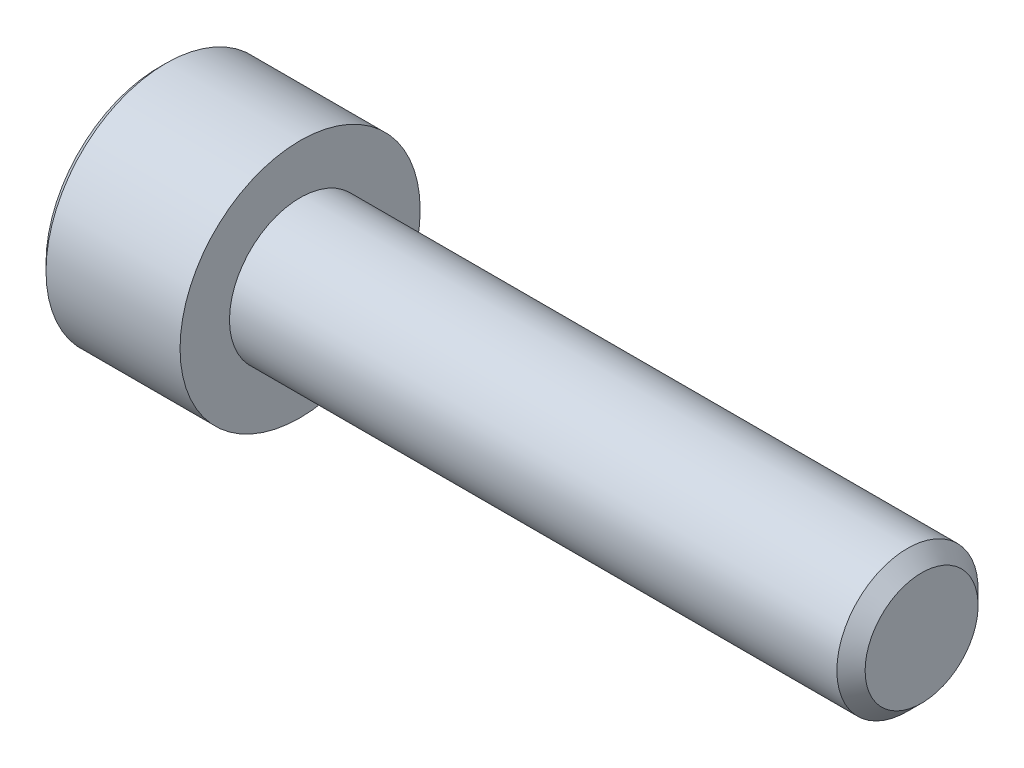
ISO-10303-21;
HEADER;
FILE_DESCRIPTION(('STEP AP214'),'2;1');
FILE_NAME('part.step','',(''),(''),'','','');
FILE_SCHEMA(('AUTOMOTIVE_DESIGN { 1 0 10303 214 1 1 1 1 }'));
ENDSEC;
DATA;
#1=APPLICATION_CONTEXT('core data for automotive mechanical design processes');
#2=APPLICATION_PROTOCOL_DEFINITION('international standard','automotive_design',2000,#1);
#3=PRODUCT_CONTEXT('',#1,'mechanical');
#4=PRODUCT('Part','Part','',(#3));
#5=PRODUCT_RELATED_PRODUCT_CATEGORY('part','',(#4));
#6=PRODUCT_DEFINITION_FORMATION('','',#4);
#7=PRODUCT_DEFINITION_CONTEXT('part definition',#1,'design');
#8=PRODUCT_DEFINITION('design','',#6,#7);
#9=PRODUCT_DEFINITION_SHAPE('','',#8);
#10=(LENGTH_UNIT() NAMED_UNIT(*) SI_UNIT(.MILLI.,.METRE.));
#11=(NAMED_UNIT(*) PLANE_ANGLE_UNIT() SI_UNIT($,.RADIAN.));
#12=(NAMED_UNIT(*) SI_UNIT($,.STERADIAN.) SOLID_ANGLE_UNIT());
#13=UNCERTAINTY_MEASURE_WITH_UNIT(LENGTH_MEASURE(1.E-05),#10,'distance_accuracy_value','');
#14=(GEOMETRIC_REPRESENTATION_CONTEXT(3) GLOBAL_UNCERTAINTY_ASSIGNED_CONTEXT((#13)) GLOBAL_UNIT_ASSIGNED_CONTEXT((#10,
#11,#12)) REPRESENTATION_CONTEXT('',''));
#15=CARTESIAN_POINT('',(0.,0.,0.));
#16=DIRECTION('',(0.,0.,1.));
#17=DIRECTION('',(1.,0.,0.));
#18=AXIS2_PLACEMENT_3D('',#15,#16,#17);
#19=CARTESIAN_POINT('',(0.,0.,0.));
#20=DIRECTION('',(-1.,0.,0.));
#21=DIRECTION('',(0.,0.,1.));
#22=AXIS2_PLACEMENT_3D('',#19,#20,#21);
#23=PLANE('',#22);
#24=CARTESIAN_POINT('',(0.,0.,0.));
#25=DIRECTION('',(-1.,0.,0.));
#26=DIRECTION('',(0.,0.,1.));
#27=AXIS2_PLACEMENT_3D('',#24,#25,#26);
#28=CIRCLE('',#27,1.99999999999999);
#29=CARTESIAN_POINT('',(0.,0.,1.99999999999999));
#30=VERTEX_POINT('',#29);
#31=EDGE_CURVE('E149',#30,#30,#28,.F.);
#32=ORIENTED_EDGE('',*,*,#31,.T.);
#33=EDGE_LOOP('',(#32));
#34=FACE_BOUND('',#33,.T.);
#35=ADVANCED_FACE('F44',(#34),#23,.F.);
#36=CARTESIAN_POINT('',(0.,0.,0.));
#37=DIRECTION('',(-1.,0.,0.));
#38=DIRECTION('',(0.,0.,1.));
#39=AXIS2_PLACEMENT_3D('',#36,#37,#38);
#40=CYLINDRICAL_SURFACE('',#39,2.5);
#41=CARTESIAN_POINT('',(-0.500000000000002,0.,0.));
#42=DIRECTION('',(-1.,0.,0.));
#43=DIRECTION('',(0.,0.,1.));
#44=AXIS2_PLACEMENT_3D('',#41,#42,#43);
#45=CIRCLE('',#44,2.5);
#46=CARTESIAN_POINT('',(-0.500000000000002,0.,2.5));
#47=VERTEX_POINT('',#46);
#48=EDGE_CURVE('E145',#47,#47,#45,.T.);
#49=ORIENTED_EDGE('',*,*,#48,.T.);
#50=EDGE_LOOP('',(#49));
#51=FACE_BOUND('',#50,.T.);
#52=CARTESIAN_POINT('',(-22.,0.,0.));
#53=DIRECTION('',(-1.,0.,0.));
#54=DIRECTION('',(0.,0.,1.));
#55=AXIS2_PLACEMENT_3D('',#52,#53,#54);
#56=CIRCLE('',#55,2.5);
#57=CARTESIAN_POINT('',(-22.,0.,2.5));
#58=VERTEX_POINT('',#57);
#59=EDGE_CURVE('E141',#58,#58,#56,.T.);
#60=ORIENTED_EDGE('',*,*,#59,.F.);
#61=EDGE_LOOP('',(#60));
#62=FACE_BOUND('',#61,.T.);
#63=ADVANCED_FACE('F173',(#51,#62),#40,.T.);
#64=CARTESIAN_POINT('',(-22.,2.5,0.));
#65=DIRECTION('',(-1.,0.,0.));
#66=DIRECTION('',(0.,0.,1.));
#67=AXIS2_PLACEMENT_3D('',#64,#65,#66);
#68=PLANE('',#67);
#69=CARTESIAN_POINT('',(-22.,0.,0.));
#70=DIRECTION('',(-1.,0.,0.));
#71=DIRECTION('',(0.,0.,1.));
#72=AXIS2_PLACEMENT_3D('',#69,#70,#71);
#73=CIRCLE('',#72,4.25);
#74=CARTESIAN_POINT('',(-22.,0.,4.25));
#75=VERTEX_POINT('',#74);
#76=EDGE_CURVE('E126',#75,#75,#73,.T.);
#77=ORIENTED_EDGE('',*,*,#76,.F.);
#78=EDGE_LOOP('',(#77));
#79=FACE_BOUND('',#78,.T.);
#80=ORIENTED_EDGE('',*,*,#59,.T.);
#81=EDGE_LOOP('',(#80));
#82=FACE_BOUND('',#81,.T.);
#83=ADVANCED_FACE('F178',(#79,#82),#68,.F.);
#84=CARTESIAN_POINT('',(0.,0.,0.));
#85=DIRECTION('',(-1.,0.,0.));
#86=DIRECTION('',(0.,0.,1.));
#87=AXIS2_PLACEMENT_3D('',#84,#85,#86);
#88=CYLINDRICAL_SURFACE('',#87,4.25);
#89=CARTESIAN_POINT('',(-26.745,0.,0.));
#90=DIRECTION('',(1.,0.,0.));
#91=DIRECTION('',(0.,0.,-1.));
#92=AXIS2_PLACEMENT_3D('',#89,#90,#91);
#93=CIRCLE('',#92,4.25);
#94=CARTESIAN_POINT('',(-26.745,0.,-4.25));
#95=VERTEX_POINT('',#94);
#96=EDGE_CURVE('E11',#95,#95,#93,.T.);
#97=ORIENTED_EDGE('',*,*,#96,.T.);
#98=EDGE_LOOP('',(#97));
#99=FACE_BOUND('',#98,.T.);
#100=ORIENTED_EDGE('',*,*,#76,.T.);
#101=EDGE_LOOP('',(#100));
#102=FACE_BOUND('',#101,.T.);
#103=ADVANCED_FACE('F190',(#99,#102),#88,.T.);
#104=CARTESIAN_POINT('',(-27.,4.25,0.));
#105=DIRECTION('',(1.,0.,0.));
#106=DIRECTION('',(0.,0.,-1.));
#107=AXIS2_PLACEMENT_3D('',#104,#105,#106);
#108=PLANE('',#107);
#109=CARTESIAN_POINT('',(-27.,0.,0.));
#110=DIRECTION('',(1.,0.,0.));
#111=DIRECTION('',(0.,0.,-1.));
#112=AXIS2_PLACEMENT_3D('',#109,#110,#111);
#113=CIRCLE('',#112,3.995);
#114=CARTESIAN_POINT('',(-27.,0.,-3.995));
#115=VERTEX_POINT('',#114);
#116=EDGE_CURVE('E53',#115,#115,#113,.F.);
#117=ORIENTED_EDGE('',*,*,#116,.T.);
#118=EDGE_LOOP('',(#117));
#119=FACE_BOUND('',#118,.T.);
#120=DIRECTION('',(0.,-0.5,-0.866025403784439));
#121=VECTOR('',#120,1.);
#122=CARTESIAN_POINT('',(-27.,2.3094010767585,0.));
#123=LINE('',#122,#121);
#124=CARTESIAN_POINT('',(-27.,2.3094010767585,0.));
#125=VERTEX_POINT('',#124);
#126=CARTESIAN_POINT('',(-27.,1.15470053837925,-2.));
#127=VERTEX_POINT('',#126);
#128=EDGE_CURVE('E377',#125,#127,#123,.T.);
#129=ORIENTED_EDGE('',*,*,#128,.F.);
#130=DIRECTION('',(0.,0.5,-0.866025403784439));
#131=VECTOR('',#130,1.);
#132=CARTESIAN_POINT('',(-27.,1.15470053837925,2.));
#133=LINE('',#132,#131);
#134=CARTESIAN_POINT('',(-27.,1.15470053837925,2.));
#135=VERTEX_POINT('',#134);
#136=EDGE_CURVE('E60',#135,#125,#133,.T.);
#137=ORIENTED_EDGE('',*,*,#136,.F.);
#138=DIRECTION('',(0.,1.,0.));
#139=VECTOR('',#138,1.);
#140=CARTESIAN_POINT('',(-27.,-1.15470053837925,2.));
#141=LINE('',#140,#139);
#142=CARTESIAN_POINT('',(-27.,-1.15470053837925,2.));
#143=VERTEX_POINT('',#142);
#144=EDGE_CURVE('E95',#143,#135,#141,.T.);
#145=ORIENTED_EDGE('',*,*,#144,.F.);
#146=DIRECTION('',(0.,0.5,0.866025403784439));
#147=VECTOR('',#146,1.);
#148=CARTESIAN_POINT('',(-27.,-2.3094010767585,0.));
#149=LINE('',#148,#147);
#150=CARTESIAN_POINT('',(-27.,-2.3094010767585,0.));
#151=VERTEX_POINT('',#150);
#152=EDGE_CURVE('E104',#151,#143,#149,.T.);
#153=ORIENTED_EDGE('',*,*,#152,.F.);
#154=DIRECTION('',(0.,-0.5,0.866025403784439));
#155=VECTOR('',#154,1.);
#156=CARTESIAN_POINT('',(-27.,-1.15470053837925,-2.));
#157=LINE('',#156,#155);
#158=CARTESIAN_POINT('',(-27.,-1.15470053837925,-2.));
#159=VERTEX_POINT('',#158);
#160=EDGE_CURVE('E111',#159,#151,#157,.T.);
#161=ORIENTED_EDGE('',*,*,#160,.F.);
#162=DIRECTION('',(0.,-1.,0.));
#163=VECTOR('',#162,1.);
#164=CARTESIAN_POINT('',(-27.,1.15470053837925,-2.));
#165=LINE('',#164,#163);
#166=EDGE_CURVE('E381',#127,#159,#165,.T.);
#167=ORIENTED_EDGE('',*,*,#166,.F.);
#168=EDGE_LOOP('',(#129,#137,#145,#153,#161,#167));
#169=FACE_BOUND('',#168,.T.);
#170=ADVANCED_FACE('F114',(#119,#169),#108,.F.);
#171=CARTESIAN_POINT('',(-0.500000000000002,0.,0.));
#172=DIRECTION('',(-1.,0.,0.));
#173=DIRECTION('',(0.,0.,1.));
#174=AXIS2_PLACEMENT_3D('',#171,#172,#173);
#175=CONICAL_SURFACE('',#174,2.5,0.78539816339745);
#176=ORIENTED_EDGE('',*,*,#31,.F.);
#177=EDGE_LOOP('',(#176));
#178=FACE_BOUND('',#177,.T.);
#179=ORIENTED_EDGE('',*,*,#48,.F.);
#180=EDGE_LOOP('',(#179));
#181=FACE_BOUND('',#180,.T.);
#182=ADVANCED_FACE('F182',(#178,#181),#175,.T.);
#183=CARTESIAN_POINT('',(-24.5,1.15470053837925,2.));
#184=DIRECTION('',(0.,0.866025403784439,0.5));
#185=DIRECTION('',(0.,-0.5,0.866025403784439));
#186=AXIS2_PLACEMENT_3D('',#183,#184,#185);
#187=PLANE('',#186);
#188=ORIENTED_EDGE('',*,*,#136,.T.);
#189=DIRECTION('',(-1.,0.,0.));
#190=VECTOR('',#189,1.);
#191=CARTESIAN_POINT('',(-24.5,2.3094010767585,0.));
#192=LINE('',#191,#190);
#193=CARTESIAN_POINT('',(-24.5,2.3094010767585,0.));
#194=VERTEX_POINT('',#193);
#195=EDGE_CURVE('E135',#194,#125,#192,.T.);
#196=ORIENTED_EDGE('',*,*,#195,.F.);
#197=DIRECTION('',(0.,0.5,-0.866025403784439));
#198=VECTOR('',#197,1.);
#199=CARTESIAN_POINT('',(-24.5,1.15470053837925,2.));
#200=LINE('',#199,#198);
#201=CARTESIAN_POINT('',(-24.5,1.15470053837925,2.));
#202=VERTEX_POINT('',#201);
#203=EDGE_CURVE('E116',#202,#194,#200,.T.);
#204=ORIENTED_EDGE('',*,*,#203,.F.);
#205=DIRECTION('',(-1.,0.,0.));
#206=VECTOR('',#205,1.);
#207=CARTESIAN_POINT('',(-24.5,1.15470053837925,2.));
#208=LINE('',#207,#206);
#209=EDGE_CURVE('E100',#202,#135,#208,.T.);
#210=ORIENTED_EDGE('',*,*,#209,.T.);
#211=EDGE_LOOP('',(#188,#196,#204,#210));
#212=FACE_BOUND('',#211,.T.);
#213=ADVANCED_FACE('F184',(#212),#187,.F.);
#214=CARTESIAN_POINT('',(-24.5,-1.15470053837925,2.));
#215=DIRECTION('',(0.,0.,1.));
#216=DIRECTION('',(0.,-1.,0.));
#217=AXIS2_PLACEMENT_3D('',#214,#215,#216);
#218=PLANE('',#217);
#219=ORIENTED_EDGE('',*,*,#144,.T.);
#220=ORIENTED_EDGE('',*,*,#209,.F.);
#221=DIRECTION('',(0.,1.,0.));
#222=VECTOR('',#221,1.);
#223=CARTESIAN_POINT('',(-24.5,-1.15470053837925,2.));
#224=LINE('',#223,#222);
#225=CARTESIAN_POINT('',(-24.5,-1.15470053837925,2.));
#226=VERTEX_POINT('',#225);
#227=EDGE_CURVE('E97',#226,#202,#224,.T.);
#228=ORIENTED_EDGE('',*,*,#227,.F.);
#229=DIRECTION('',(-1.,0.,0.));
#230=VECTOR('',#229,1.);
#231=CARTESIAN_POINT('',(-24.5,-1.15470053837925,2.));
#232=LINE('',#231,#230);
#233=EDGE_CURVE('E90',#226,#143,#232,.T.);
#234=ORIENTED_EDGE('',*,*,#233,.T.);
#235=EDGE_LOOP('',(#219,#220,#228,#234));
#236=FACE_BOUND('',#235,.T.);
#237=ADVANCED_FACE('F92',(#236),#218,.F.);
#238=CARTESIAN_POINT('',(-24.5,-2.3094010767585,0.));
#239=DIRECTION('',(0.,-0.866025403784439,0.5));
#240=DIRECTION('',(0.,-0.5,-0.866025403784439));
#241=AXIS2_PLACEMENT_3D('',#238,#239,#240);
#242=PLANE('',#241);
#243=ORIENTED_EDGE('',*,*,#152,.T.);
#244=ORIENTED_EDGE('',*,*,#233,.F.);
#245=DIRECTION('',(0.,0.5,0.866025403784439));
#246=VECTOR('',#245,1.);
#247=CARTESIAN_POINT('',(-24.5,-2.3094010767585,0.));
#248=LINE('',#247,#246);
#249=CARTESIAN_POINT('',(-24.5,-2.3094010767585,0.));
#250=VERTEX_POINT('',#249);
#251=EDGE_CURVE('E69',#250,#226,#248,.T.);
#252=ORIENTED_EDGE('',*,*,#251,.F.);
#253=DIRECTION('',(-1.,0.,0.));
#254=VECTOR('',#253,1.);
#255=CARTESIAN_POINT('',(-24.5,-2.3094010767585,0.));
#256=LINE('',#255,#254);
#257=EDGE_CURVE('E101',#250,#151,#256,.T.);
#258=ORIENTED_EDGE('',*,*,#257,.T.);
#259=EDGE_LOOP('',(#243,#244,#252,#258));
#260=FACE_BOUND('',#259,.T.);
#261=ADVANCED_FACE('F105',(#260),#242,.F.);
#262=CARTESIAN_POINT('',(-24.5,-1.15470053837925,-2.));
#263=DIRECTION('',(0.,-0.866025403784439,-0.5));
#264=DIRECTION('',(0.,0.5,-0.866025403784439));
#265=AXIS2_PLACEMENT_3D('',#262,#263,#264);
#266=PLANE('',#265);
#267=ORIENTED_EDGE('',*,*,#160,.T.);
#268=ORIENTED_EDGE('',*,*,#257,.F.);
#269=DIRECTION('',(0.,-0.5,0.866025403784439));
#270=VECTOR('',#269,1.);
#271=CARTESIAN_POINT('',(-24.5,-1.15470053837925,-2.));
#272=LINE('',#271,#270);
#273=CARTESIAN_POINT('',(-24.5,-1.15470053837925,-2.));
#274=VERTEX_POINT('',#273);
#275=EDGE_CURVE('E372',#274,#250,#272,.T.);
#276=ORIENTED_EDGE('',*,*,#275,.F.);
#277=DIRECTION('',(-1.,0.,0.));
#278=VECTOR('',#277,1.);
#279=CARTESIAN_POINT('',(-24.5,-1.15470053837925,-2.));
#280=LINE('',#279,#278);
#281=EDGE_CURVE('E130',#274,#159,#280,.T.);
#282=ORIENTED_EDGE('',*,*,#281,.T.);
#283=EDGE_LOOP('',(#267,#268,#276,#282));
#284=FACE_BOUND('',#283,.T.);
#285=ADVANCED_FACE('F208',(#284),#266,.F.);
#286=CARTESIAN_POINT('',(-24.5,1.15470053837925,-2.));
#287=DIRECTION('',(0.,0.,-1.));
#288=DIRECTION('',(-1.,0.,0.));
#289=AXIS2_PLACEMENT_3D('',#286,#287,#288);
#290=PLANE('',#289);
#291=ORIENTED_EDGE('',*,*,#166,.T.);
#292=ORIENTED_EDGE('',*,*,#281,.F.);
#293=DIRECTION('',(0.,-1.,0.));
#294=VECTOR('',#293,1.);
#295=CARTESIAN_POINT('',(-24.5,1.15470053837925,-2.));
#296=LINE('',#295,#294);
#297=CARTESIAN_POINT('',(-24.5,1.15470053837925,-2.));
#298=VERTEX_POINT('',#297);
#299=EDGE_CURVE('E369',#298,#274,#296,.T.);
#300=ORIENTED_EDGE('',*,*,#299,.F.);
#301=DIRECTION('',(-1.,0.,0.));
#302=VECTOR('',#301,1.);
#303=CARTESIAN_POINT('',(-24.5,1.15470053837925,-2.));
#304=LINE('',#303,#302);
#305=EDGE_CURVE('E132',#298,#127,#304,.T.);
#306=ORIENTED_EDGE('',*,*,#305,.T.);
#307=EDGE_LOOP('',(#291,#292,#300,#306));
#308=FACE_BOUND('',#307,.T.);
#309=ADVANCED_FACE('F168',(#308),#290,.F.);
#310=CARTESIAN_POINT('',(-24.5,2.3094010767585,0.));
#311=DIRECTION('',(0.,0.866025403784439,-0.5));
#312=DIRECTION('',(0.,0.5,0.866025403784439));
#313=AXIS2_PLACEMENT_3D('',#310,#311,#312);
#314=PLANE('',#313);
#315=ORIENTED_EDGE('',*,*,#128,.T.);
#316=ORIENTED_EDGE('',*,*,#305,.F.);
#317=DIRECTION('',(0.,-0.5,-0.866025403784439));
#318=VECTOR('',#317,1.);
#319=CARTESIAN_POINT('',(-24.5,2.3094010767585,0.));
#320=LINE('',#319,#318);
#321=EDGE_CURVE('E121',#194,#298,#320,.T.);
#322=ORIENTED_EDGE('',*,*,#321,.F.);
#323=ORIENTED_EDGE('',*,*,#195,.T.);
#324=EDGE_LOOP('',(#315,#316,#322,#323));
#325=FACE_BOUND('',#324,.T.);
#326=ADVANCED_FACE('F160',(#325),#314,.F.);
#327=CARTESIAN_POINT('',(-27.,0.,0.));
#328=DIRECTION('',(1.,0.,0.));
#329=DIRECTION('',(0.,0.,-1.));
#330=AXIS2_PLACEMENT_3D('',#327,#328,#329);
#331=CONICAL_SURFACE('',#330,3.995,0.785398163397448);
#332=ORIENTED_EDGE('',*,*,#96,.F.);
#333=EDGE_LOOP('',(#332));
#334=FACE_BOUND('',#333,.T.);
#335=ORIENTED_EDGE('',*,*,#116,.F.);
#336=EDGE_LOOP('',(#335));
#337=FACE_BOUND('',#336,.T.);
#338=ADVANCED_FACE('F46',(#334,#337),#331,.T.);
#339=CARTESIAN_POINT('',(-24.5,-1.15470053837925,-2.));
#340=DIRECTION('',(0.857167300702113,-0.446036056788338,-0.257519037455026));
#341=DIRECTION('',(0.461604487477352,0.887085845417889,0.));
#342=AXIS2_PLACEMENT_3D('',#339,#340,#341);
#343=PLANE('',#342);
#344=ORIENTED_EDGE('',*,*,#275,.T.);
#345=DIRECTION('',(-0.461604487477352,-0.887085845417889,0.));
#346=VECTOR('',#345,1.);
#347=CARTESIAN_POINT('',(-24.027169982274,-1.40074263128796,0.));
#348=LINE('',#347,#346);
#349=CARTESIAN_POINT('',(-23.2982787619449,0.,0.));
#350=VERTEX_POINT('',#349);
#351=EDGE_CURVE('E390',#350,#250,#348,.T.);
#352=ORIENTED_EDGE('',*,*,#351,.F.);
#353=DIRECTION('',(-0.461604487477352,-0.443542922708944,-0.768238877469488));
#354=VECTOR('',#353,1.);
#355=CARTESIAN_POINT('',(-24.027169982274,-0.700371315643979,-1.21307870285923));
#356=LINE('',#355,#354);
#357=EDGE_CURVE('E354',#350,#274,#356,.T.);
#358=ORIENTED_EDGE('',*,*,#357,.T.);
#359=EDGE_LOOP('',(#344,#352,#358));
#360=FACE_BOUND('',#359,.T.);
#361=ADVANCED_FACE('F159',(#360),#343,.F.);
#362=CARTESIAN_POINT('',(-24.5,1.15470053837925,-2.));
#363=DIRECTION('',(0.857167300702113,0.,-0.515038074910052));
#364=DIRECTION('',(-0.515038074910052,0.,-0.857167300702113));
#365=AXIS2_PLACEMENT_3D('',#362,#363,#364);
#366=PLANE('',#365);
#367=ORIENTED_EDGE('',*,*,#299,.T.);
#368=ORIENTED_EDGE('',*,*,#357,.F.);
#369=DIRECTION('',(-0.461604487477352,0.443542922708945,-0.768238877469487));
#370=VECTOR('',#369,1.);
#371=CARTESIAN_POINT('',(-24.027169982274,0.700371315643978,-1.21307870285923));
#372=LINE('',#371,#370);
#373=EDGE_CURVE('E356',#350,#298,#372,.T.);
#374=ORIENTED_EDGE('',*,*,#373,.T.);
#375=EDGE_LOOP('',(#367,#368,#374));
#376=FACE_BOUND('',#375,.T.);
#377=ADVANCED_FACE('F165',(#376),#366,.F.);
#378=CARTESIAN_POINT('',(-24.5,2.3094010767585,0.));
#379=DIRECTION('',(0.857167300702113,0.446036056788338,-0.257519037455026));
#380=DIRECTION('',(-0.461604487477352,0.887085845417889,0.));
#381=AXIS2_PLACEMENT_3D('',#378,#379,#380);
#382=PLANE('',#381);
#383=ORIENTED_EDGE('',*,*,#321,.T.);
#384=ORIENTED_EDGE('',*,*,#373,.F.);
#385=DIRECTION('',(-0.461604487477352,0.887085845417889,0.));
#386=VECTOR('',#385,1.);
#387=CARTESIAN_POINT('',(-24.027169982274,1.40074263128796,0.));
#388=LINE('',#387,#386);
#389=EDGE_CURVE('E341',#350,#194,#388,.T.);
#390=ORIENTED_EDGE('',*,*,#389,.T.);
#391=EDGE_LOOP('',(#383,#384,#390));
#392=FACE_BOUND('',#391,.T.);
#393=ADVANCED_FACE('F219',(#392),#382,.F.);
#394=CARTESIAN_POINT('',(-24.5,1.15470053837925,2.));
#395=DIRECTION('',(0.857167300702113,0.446036056788338,0.257519037455026));
#396=DIRECTION('',(-0.461604487477352,0.887085845417889,0.));
#397=AXIS2_PLACEMENT_3D('',#394,#395,#396);
#398=PLANE('',#397);
#399=ORIENTED_EDGE('',*,*,#203,.T.);
#400=ORIENTED_EDGE('',*,*,#389,.F.);
#401=DIRECTION('',(-0.461604487477352,0.443542922708944,0.768238877469488));
#402=VECTOR('',#401,1.);
#403=CARTESIAN_POINT('',(-24.027169982274,0.700371315643978,1.21307870285923));
#404=LINE('',#403,#402);
#405=EDGE_CURVE('E330',#350,#202,#404,.T.);
#406=ORIENTED_EDGE('',*,*,#405,.T.);
#407=EDGE_LOOP('',(#399,#400,#406));
#408=FACE_BOUND('',#407,.T.);
#409=ADVANCED_FACE('F223',(#408),#398,.F.);
#410=CARTESIAN_POINT('',(-24.5,-1.15470053837925,2.));
#411=DIRECTION('',(0.857167300702113,0.,0.515038074910052));
#412=DIRECTION('',(0.515038074910052,0.,-0.857167300702114));
#413=AXIS2_PLACEMENT_3D('',#410,#411,#412);
#414=PLANE('',#413);
#415=ORIENTED_EDGE('',*,*,#227,.T.);
#416=ORIENTED_EDGE('',*,*,#405,.F.);
#417=DIRECTION('',(-0.461604487477352,-0.443542922708945,0.768238877469488));
#418=VECTOR('',#417,1.);
#419=CARTESIAN_POINT('',(-24.027169982274,-0.700371315643978,1.21307870285923));
#420=LINE('',#419,#418);
#421=EDGE_CURVE('E331',#350,#226,#420,.T.);
#422=ORIENTED_EDGE('',*,*,#421,.T.);
#423=EDGE_LOOP('',(#415,#416,#422));
#424=FACE_BOUND('',#423,.T.);
#425=ADVANCED_FACE('F227',(#424),#414,.F.);
#426=CARTESIAN_POINT('',(-24.5,-2.3094010767585,0.));
#427=DIRECTION('',(0.857167300702113,-0.446036056788338,0.257519037455026));
#428=DIRECTION('',(0.461604487477352,0.887085845417889,0.));
#429=AXIS2_PLACEMENT_3D('',#426,#427,#428);
#430=PLANE('',#429);
#431=ORIENTED_EDGE('',*,*,#251,.T.);
#432=ORIENTED_EDGE('',*,*,#421,.F.);
#433=ORIENTED_EDGE('',*,*,#351,.T.);
#434=EDGE_LOOP('',(#431,#432,#433));
#435=FACE_BOUND('',#434,.T.);
#436=ADVANCED_FACE('F231',(#435),#430,.F.);
#437=CLOSED_SHELL('',(#35,#63,#83,#103,#170,#182,#213,#237,#261,#285,#309,#326,#338,#361,#377,
#393,#409,#425,#436));
#438=MANIFOLD_SOLID_BREP('B2',#437);
#439=ADVANCED_BREP_SHAPE_REPRESENTATION('',(#18,#438),#14);
#440=SHAPE_DEFINITION_REPRESENTATION(#9,#439);
ENDSEC;
END-ISO-10303-21;
